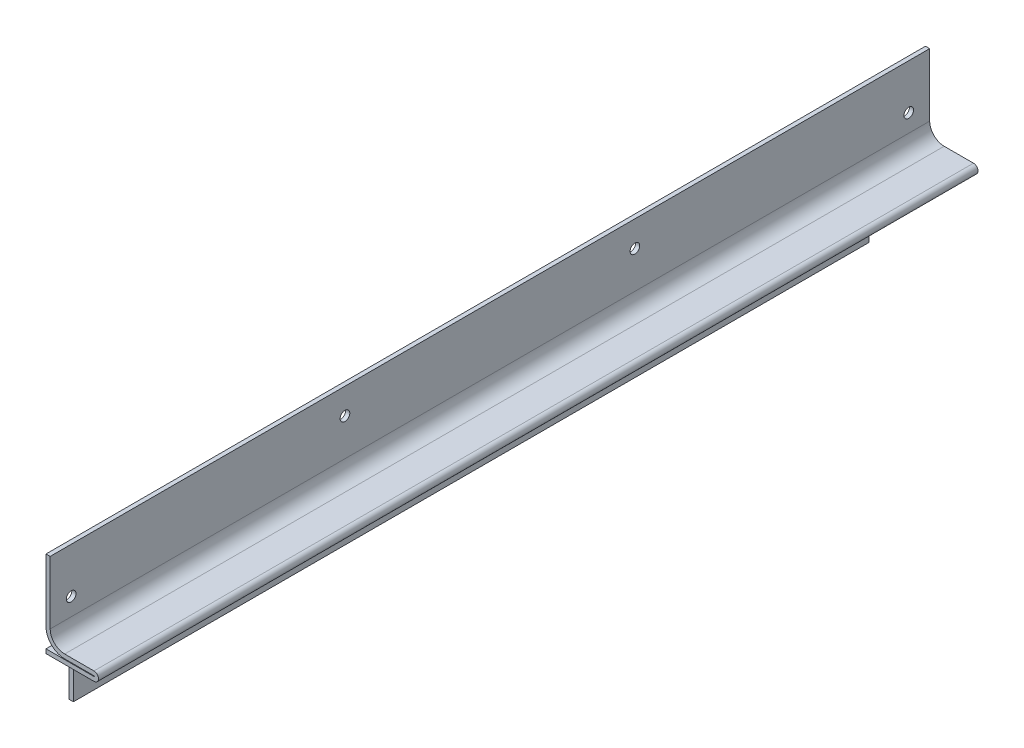
ISO-10303-21;
HEADER;
FILE_DESCRIPTION(('STEP AP214'),'2;1');
FILE_NAME('part.step','',(''),(''),'','','');
FILE_SCHEMA(('AUTOMOTIVE_DESIGN { 1 0 10303 214 1 1 1 1 }'));
ENDSEC;
DATA;
#1=APPLICATION_CONTEXT('core data for automotive mechanical design processes');
#2=APPLICATION_PROTOCOL_DEFINITION('international standard','automotive_design',2000,#1);
#3=PRODUCT_CONTEXT('',#1,'mechanical');
#4=PRODUCT('Part','Part','',(#3));
#5=PRODUCT_RELATED_PRODUCT_CATEGORY('part','',(#4));
#6=PRODUCT_DEFINITION_FORMATION('','',#4);
#7=PRODUCT_DEFINITION_CONTEXT('part definition',#1,'design');
#8=PRODUCT_DEFINITION('design','',#6,#7);
#9=PRODUCT_DEFINITION_SHAPE('','',#8);
#10=(LENGTH_UNIT() NAMED_UNIT(*) SI_UNIT(.MILLI.,.METRE.));
#11=(NAMED_UNIT(*) PLANE_ANGLE_UNIT() SI_UNIT($,.RADIAN.));
#12=(NAMED_UNIT(*) SI_UNIT($,.STERADIAN.) SOLID_ANGLE_UNIT());
#13=UNCERTAINTY_MEASURE_WITH_UNIT(LENGTH_MEASURE(1.E-05),#10,'distance_accuracy_value','');
#14=(GEOMETRIC_REPRESENTATION_CONTEXT(3) GLOBAL_UNCERTAINTY_ASSIGNED_CONTEXT((#13)) GLOBAL_UNIT_ASSIGNED_CONTEXT((#10,
#11,#12)) REPRESENTATION_CONTEXT('',''));
#15=CARTESIAN_POINT('',(0.,0.,0.));
#16=DIRECTION('',(0.,0.,1.));
#17=DIRECTION('',(1.,0.,0.));
#18=AXIS2_PLACEMENT_3D('',#15,#16,#17);
#19=CARTESIAN_POINT('',(-25.9398169786098,-36.9078676555998,-136.5));
#20=DIRECTION('',(0.,-1.,0.));
#21=DIRECTION('',(0.,0.,-1.));
#22=AXIS2_PLACEMENT_3D('',#19,#20,#21);
#23=PLANE('',#22);
#24=DIRECTION('',(1.,0.,0.));
#25=VECTOR('',#24,1.);
#26=CARTESIAN_POINT('',(-25.9398169786098,-36.9078676555998,123.5));
#27=LINE('',#26,#25);
#28=CARTESIAN_POINT('',(-25.9398169786098,-36.9078676555997,123.5));
#29=VERTEX_POINT('',#28);
#30=CARTESIAN_POINT('',(-27.2398169786098,-36.9078676555998,123.5));
#31=VERTEX_POINT('',#30);
#32=EDGE_CURVE('E159',#29,#31,#27,.F.);
#33=ORIENTED_EDGE('',*,*,#32,.T.);
#34=DIRECTION('',(0.,0.,1.));
#35=VECTOR('',#34,1.);
#36=CARTESIAN_POINT('',(-27.2398169786098,-36.9078676555998,-136.5));
#37=LINE('',#36,#35);
#38=CARTESIAN_POINT('',(-27.2398169786098,-36.9078676555998,-123.5));
#39=VERTEX_POINT('',#38);
#40=EDGE_CURVE('E191',#39,#31,#37,.T.);
#41=ORIENTED_EDGE('',*,*,#40,.F.);
#42=DIRECTION('',(1.,0.,0.));
#43=VECTOR('',#42,1.);
#44=CARTESIAN_POINT('',(-27.2398169786098,-36.9078676555998,-123.5));
#45=LINE('',#44,#43);
#46=CARTESIAN_POINT('',(-25.9398169786098,-36.9078676555998,-123.5));
#47=VERTEX_POINT('',#46);
#48=EDGE_CURVE('E195',#39,#47,#45,.T.);
#49=ORIENTED_EDGE('',*,*,#48,.T.);
#50=DIRECTION('',(0.,0.,-1.));
#51=VECTOR('',#50,1.);
#52=CARTESIAN_POINT('',(-25.9398169786098,-36.9078676555997,-136.5));
#53=LINE('',#52,#51);
#54=EDGE_CURVE('E209',#29,#47,#53,.T.);
#55=ORIENTED_EDGE('',*,*,#54,.F.);
#56=EDGE_LOOP('',(#33,#41,#49,#55));
#57=FACE_BOUND('',#56,.T.);
#58=ADVANCED_FACE('F17',(#57),#23,.T.);
#59=CARTESIAN_POINT('',(-27.2398169786098,-27.9078676555998,-110.5));
#60=DIRECTION('',(1.,0.,0.));
#61=DIRECTION('',(0.,0.,-1.));
#62=AXIS2_PLACEMENT_3D('',#59,#60,#61);
#63=CYLINDRICAL_SURFACE('',#62,2.09999999999999);
#64=CARTESIAN_POINT('',(-25.9398169786098,-27.9078676555998,-110.5));
#65=DIRECTION('',(1.,0.,0.));
#66=DIRECTION('',(0.,0.,-1.));
#67=AXIS2_PLACEMENT_3D('',#64,#65,#66);
#68=CIRCLE('',#67,2.09999999999999);
#69=CARTESIAN_POINT('',(-25.9398169786098,-27.9078676555998,-112.6));
#70=VERTEX_POINT('',#69);
#71=EDGE_CURVE('E192',#70,#70,#68,.F.);
#72=ORIENTED_EDGE('',*,*,#71,.F.);
#73=EDGE_LOOP('',(#72));
#74=FACE_BOUND('',#73,.T.);
#75=CARTESIAN_POINT('',(-27.2398169786098,-27.9078676555998,-110.5));
#76=DIRECTION('',(1.,0.,0.));
#77=DIRECTION('',(0.,0.,-1.));
#78=AXIS2_PLACEMENT_3D('',#75,#76,#77);
#79=CIRCLE('',#78,2.09999999999999);
#80=CARTESIAN_POINT('',(-27.2398169786098,-27.9078676555998,-112.6));
#81=VERTEX_POINT('',#80);
#82=EDGE_CURVE('E188',#81,#81,#79,.T.);
#83=ORIENTED_EDGE('',*,*,#82,.F.);
#84=EDGE_LOOP('',(#83));
#85=FACE_BOUND('',#84,.T.);
#86=ADVANCED_FACE('F520',(#74,#85),#63,.F.);
#87=CARTESIAN_POINT('',(-27.2398169786098,-27.9078676555998,-58.5));
#88=DIRECTION('',(1.,0.,0.));
#89=DIRECTION('',(0.,0.,-1.));
#90=AXIS2_PLACEMENT_3D('',#87,#88,#89);
#91=CYLINDRICAL_SURFACE('',#90,2.1);
#92=CARTESIAN_POINT('',(-25.9398169786098,-27.9078676555998,-58.5));
#93=DIRECTION('',(1.,0.,0.));
#94=DIRECTION('',(0.,0.,-1.));
#95=AXIS2_PLACEMENT_3D('',#92,#93,#94);
#96=CIRCLE('',#95,2.1);
#97=CARTESIAN_POINT('',(-25.9398169786098,-27.9078676555998,-60.6));
#98=VERTEX_POINT('',#97);
#99=EDGE_CURVE('E196',#98,#98,#96,.F.);
#100=ORIENTED_EDGE('',*,*,#99,.F.);
#101=EDGE_LOOP('',(#100));
#102=FACE_BOUND('',#101,.T.);
#103=CARTESIAN_POINT('',(-27.2398169786098,-27.9078676555998,-58.5));
#104=DIRECTION('',(1.,0.,0.));
#105=DIRECTION('',(0.,0.,-1.));
#106=AXIS2_PLACEMENT_3D('',#103,#104,#105);
#107=CIRCLE('',#106,2.1);
#108=CARTESIAN_POINT('',(-27.2398169786098,-27.9078676555998,-60.6));
#109=VERTEX_POINT('',#108);
#110=EDGE_CURVE('E185',#109,#109,#107,.T.);
#111=ORIENTED_EDGE('',*,*,#110,.F.);
#112=EDGE_LOOP('',(#111));
#113=FACE_BOUND('',#112,.T.);
#114=ADVANCED_FACE('F525',(#102,#113),#91,.F.);
#115=CARTESIAN_POINT('',(-27.2398169786098,-27.9078676555998,-84.5));
#116=DIRECTION('',(1.,0.,0.));
#117=DIRECTION('',(0.,1.,0.));
#118=AXIS2_PLACEMENT_3D('',#115,#116,#117);
#119=CYLINDRICAL_SURFACE('',#118,3.00000000000001);
#120=CARTESIAN_POINT('',(-25.9398169786098,-27.9078676555998,-84.5));
#121=DIRECTION('',(1.,0.,0.));
#122=DIRECTION('',(0.,1.,0.));
#123=AXIS2_PLACEMENT_3D('',#120,#121,#122);
#124=CIRCLE('',#123,3.00000000000001);
#125=CARTESIAN_POINT('',(-25.9398169786098,-24.9078676555998,-84.5));
#126=VERTEX_POINT('',#125);
#127=EDGE_CURVE('E199',#126,#126,#124,.F.);
#128=ORIENTED_EDGE('',*,*,#127,.F.);
#129=EDGE_LOOP('',(#128));
#130=FACE_BOUND('',#129,.T.);
#131=CARTESIAN_POINT('',(-27.2398169786098,-27.9078676555998,-84.5));
#132=DIRECTION('',(1.,0.,0.));
#133=DIRECTION('',(0.,1.,0.));
#134=AXIS2_PLACEMENT_3D('',#131,#132,#133);
#135=CIRCLE('',#134,3.00000000000001);
#136=CARTESIAN_POINT('',(-27.2398169786098,-24.9078676555998,-84.5));
#137=VERTEX_POINT('',#136);
#138=EDGE_CURVE('E182',#137,#137,#135,.T.);
#139=ORIENTED_EDGE('',*,*,#138,.F.);
#140=EDGE_LOOP('',(#139));
#141=FACE_BOUND('',#140,.T.);
#142=ADVANCED_FACE('F534',(#130,#141),#119,.F.);
#143=CARTESIAN_POINT('',(-26.5898169786098,-27.9078676555998,110.5));
#144=DIRECTION('',(1.,0.,0.));
#145=DIRECTION('',(0.,0.,-1.));
#146=AXIS2_PLACEMENT_3D('',#143,#144,#145);
#147=CYLINDRICAL_SURFACE('',#146,2.1);
#148=CARTESIAN_POINT('',(-25.9398169786098,-27.9078676555998,110.5));
#149=DIRECTION('',(1.,0.,0.));
#150=DIRECTION('',(0.,0.,-1.));
#151=AXIS2_PLACEMENT_3D('',#148,#149,#150);
#152=CIRCLE('',#151,2.1);
#153=CARTESIAN_POINT('',(-25.9398169786098,-27.9078676555998,108.4));
#154=VERTEX_POINT('',#153);
#155=EDGE_CURVE('E202',#154,#154,#152,.F.);
#156=ORIENTED_EDGE('',*,*,#155,.F.);
#157=EDGE_LOOP('',(#156));
#158=FACE_BOUND('',#157,.T.);
#159=CARTESIAN_POINT('',(-27.2398169786098,-27.9078676555998,110.5));
#160=DIRECTION('',(1.,0.,0.));
#161=DIRECTION('',(0.,0.,-1.));
#162=AXIS2_PLACEMENT_3D('',#159,#160,#161);
#163=CIRCLE('',#162,2.1);
#164=CARTESIAN_POINT('',(-27.2398169786098,-27.9078676555998,108.4));
#165=VERTEX_POINT('',#164);
#166=EDGE_CURVE('E179',#165,#165,#163,.T.);
#167=ORIENTED_EDGE('',*,*,#166,.F.);
#168=EDGE_LOOP('',(#167));
#169=FACE_BOUND('',#168,.T.);
#170=ADVANCED_FACE('F529',(#158,#169),#147,.F.);
#171=CARTESIAN_POINT('',(-26.5898169786098,-27.9078676555998,58.5));
#172=DIRECTION('',(1.,0.,0.));
#173=DIRECTION('',(0.,0.,-1.));
#174=AXIS2_PLACEMENT_3D('',#171,#172,#173);
#175=CYLINDRICAL_SURFACE('',#174,2.1);
#176=CARTESIAN_POINT('',(-25.9398169786098,-27.9078676555998,58.5));
#177=DIRECTION('',(1.,0.,0.));
#178=DIRECTION('',(0.,0.,-1.));
#179=AXIS2_PLACEMENT_3D('',#176,#177,#178);
#180=CIRCLE('',#179,2.1);
#181=CARTESIAN_POINT('',(-25.9398169786098,-27.9078676555998,56.4));
#182=VERTEX_POINT('',#181);
#183=EDGE_CURVE('E204',#182,#182,#180,.F.);
#184=ORIENTED_EDGE('',*,*,#183,.F.);
#185=EDGE_LOOP('',(#184));
#186=FACE_BOUND('',#185,.T.);
#187=CARTESIAN_POINT('',(-27.2398169786098,-27.9078676555998,58.5));
#188=DIRECTION('',(1.,0.,0.));
#189=DIRECTION('',(0.,0.,-1.));
#190=AXIS2_PLACEMENT_3D('',#187,#188,#189);
#191=CIRCLE('',#190,2.1);
#192=CARTESIAN_POINT('',(-27.2398169786098,-27.9078676555998,56.4));
#193=VERTEX_POINT('',#192);
#194=EDGE_CURVE('E176',#193,#193,#191,.T.);
#195=ORIENTED_EDGE('',*,*,#194,.F.);
#196=EDGE_LOOP('',(#195));
#197=FACE_BOUND('',#196,.T.);
#198=ADVANCED_FACE('F678',(#186,#197),#175,.F.);
#199=CARTESIAN_POINT('',(-26.5898169786098,-27.9078676555998,84.5));
#200=DIRECTION('',(1.,0.,0.));
#201=DIRECTION('',(0.,0.,-1.));
#202=AXIS2_PLACEMENT_3D('',#199,#200,#201);
#203=CYLINDRICAL_SURFACE('',#202,3.);
#204=CARTESIAN_POINT('',(-25.9398169786098,-27.9078676555998,84.5));
#205=DIRECTION('',(1.,0.,0.));
#206=DIRECTION('',(0.,0.,-1.));
#207=AXIS2_PLACEMENT_3D('',#204,#205,#206);
#208=CIRCLE('',#207,3.);
#209=CARTESIAN_POINT('',(-25.9398169786098,-27.9078676555998,81.5));
#210=VERTEX_POINT('',#209);
#211=EDGE_CURVE('E21',#210,#210,#208,.F.);
#212=ORIENTED_EDGE('',*,*,#211,.F.);
#213=EDGE_LOOP('',(#212));
#214=FACE_BOUND('',#213,.T.);
#215=CARTESIAN_POINT('',(-27.2398169786098,-27.9078676555998,84.5));
#216=DIRECTION('',(1.,0.,0.));
#217=DIRECTION('',(0.,0.,-1.));
#218=AXIS2_PLACEMENT_3D('',#215,#216,#217);
#219=CIRCLE('',#218,3.);
#220=CARTESIAN_POINT('',(-27.2398169786098,-27.9078676555998,81.5));
#221=VERTEX_POINT('',#220);
#222=EDGE_CURVE('E173',#221,#221,#219,.T.);
#223=ORIENTED_EDGE('',*,*,#222,.F.);
#224=EDGE_LOOP('',(#223));
#225=FACE_BOUND('',#224,.T.);
#226=ADVANCED_FACE('F670',(#214,#225),#203,.F.);
#227=CARTESIAN_POINT('',(-25.9398169786098,18.8711323444002,-136.5));
#228=DIRECTION('',(1.,0.,0.));
#229=DIRECTION('',(0.,0.,-1.));
#230=AXIS2_PLACEMENT_3D('',#227,#228,#229);
#231=PLANE('',#230);
#232=ORIENTED_EDGE('',*,*,#71,.T.);
#233=EDGE_LOOP('',(#232));
#234=FACE_BOUND('',#233,.T.);
#235=ORIENTED_EDGE('',*,*,#99,.T.);
#236=EDGE_LOOP('',(#235));
#237=FACE_BOUND('',#236,.T.);
#238=ORIENTED_EDGE('',*,*,#127,.T.);
#239=EDGE_LOOP('',(#238));
#240=FACE_BOUND('',#239,.T.);
#241=ORIENTED_EDGE('',*,*,#155,.T.);
#242=EDGE_LOOP('',(#241));
#243=FACE_BOUND('',#242,.T.);
#244=ORIENTED_EDGE('',*,*,#183,.T.);
#245=EDGE_LOOP('',(#244));
#246=FACE_BOUND('',#245,.T.);
#247=ORIENTED_EDGE('',*,*,#211,.T.);
#248=EDGE_LOOP('',(#247));
#249=FACE_BOUND('',#248,.T.);
#250=DIRECTION('',(0.,1.,0.));
#251=VECTOR('',#250,1.);
#252=CARTESIAN_POINT('',(-25.9398169786098,-12.0500206419999,123.5));
#253=LINE('',#252,#251);
#254=CARTESIAN_POINT('',(-25.9398169786098,-19.7074071403516,123.5));
#255=VERTEX_POINT('',#254);
#256=EDGE_CURVE('E144',#255,#29,#253,.F.);
#257=ORIENTED_EDGE('',*,*,#256,.T.);
#258=ORIENTED_EDGE('',*,*,#54,.T.);
#259=DIRECTION('',(0.,1.,0.));
#260=VECTOR('',#259,1.);
#261=CARTESIAN_POINT('',(-25.9398169786098,-36.9078676555998,-123.5));
#262=LINE('',#261,#260);
#263=CARTESIAN_POINT('',(-25.9398169786098,-19.7074071403516,-123.5));
#264=VERTEX_POINT('',#263);
#265=EDGE_CURVE('E146',#47,#264,#262,.T.);
#266=ORIENTED_EDGE('',*,*,#265,.T.);
#267=DIRECTION('',(0.,0.,1.));
#268=VECTOR('',#267,1.);
#269=CARTESIAN_POINT('',(-25.9398169786098,-19.7074071403516,0.));
#270=LINE('',#269,#268);
#271=EDGE_CURVE('E140',#264,#255,#270,.T.);
#272=ORIENTED_EDGE('',*,*,#271,.T.);
#273=EDGE_LOOP('',(#257,#258,#266,#272));
#274=FACE_BOUND('',#273,.T.);
#275=ADVANCED_FACE('F142',(#234,#237,#240,#243,#246,#249,#274),#231,.T.);
#276=CARTESIAN_POINT('',(-27.2398169786098,-36.9078676555998,-123.5));
#277=DIRECTION('',(0.,0.,1.));
#278=DIRECTION('',(1.,0.,0.));
#279=AXIS2_PLACEMENT_3D('',#276,#277,#278);
#280=PLANE('',#279);
#281=DIRECTION('',(0.,1.,0.));
#282=VECTOR('',#281,1.);
#283=CARTESIAN_POINT('',(-21.4398169786098,-22.4200881272211,-123.5));
#284=LINE('',#283,#282);
#285=CARTESIAN_POINT('',(-21.4398169786098,-13.9074071403516,-123.5));
#286=VERTEX_POINT('',#285);
#287=CARTESIAN_POINT('',(-21.4398169786098,-15.2074071403516,-123.5));
#288=VERTEX_POINT('',#287);
#289=EDGE_CURVE('E169',#286,#288,#284,.F.);
#290=ORIENTED_EDGE('',*,*,#289,.T.);
#291=CARTESIAN_POINT('',(-21.4398169786098,-19.7074071403516,-123.5));
#292=DIRECTION('',(0.,0.,1.));
#293=DIRECTION('',(1.,0.,0.));
#294=AXIS2_PLACEMENT_3D('',#291,#292,#293);
#295=CIRCLE('',#294,4.5);
#296=EDGE_CURVE('E167',#288,#264,#295,.T.);
#297=ORIENTED_EDGE('',*,*,#296,.T.);
#298=ORIENTED_EDGE('',*,*,#265,.F.);
#299=ORIENTED_EDGE('',*,*,#48,.F.);
#300=DIRECTION('',(0.,1.,0.));
#301=VECTOR('',#300,1.);
#302=CARTESIAN_POINT('',(-27.2398169786098,-36.9078676555998,-123.5));
#303=LINE('',#302,#301);
#304=CARTESIAN_POINT('',(-27.2398169786098,-19.7074071403516,-123.5));
#305=VERTEX_POINT('',#304);
#306=EDGE_CURVE('E308',#305,#39,#303,.F.);
#307=ORIENTED_EDGE('',*,*,#306,.F.);
#308=CARTESIAN_POINT('',(-21.4398169786098,-19.7074071403516,-123.5));
#309=DIRECTION('',(0.,0.,1.));
#310=DIRECTION('',(1.,0.,0.));
#311=AXIS2_PLACEMENT_3D('',#308,#309,#310);
#312=CIRCLE('',#311,5.8);
#313=EDGE_CURVE('E280',#286,#305,#312,.T.);
#314=ORIENTED_EDGE('',*,*,#313,.F.);
#315=EDGE_LOOP('',(#290,#297,#298,#299,#307,#314));
#316=FACE_BOUND('',#315,.T.);
#317=ADVANCED_FACE('F518',(#316),#280,.F.);
#318=CARTESIAN_POINT('',(-27.2398169786098,-36.9078676555998,-136.5));
#319=DIRECTION('',(-1.,0.,0.));
#320=DIRECTION('',(0.,0.,1.));
#321=AXIS2_PLACEMENT_3D('',#318,#319,#320);
#322=PLANE('',#321);
#323=ORIENTED_EDGE('',*,*,#222,.T.);
#324=EDGE_LOOP('',(#323));
#325=FACE_BOUND('',#324,.T.);
#326=ORIENTED_EDGE('',*,*,#194,.T.);
#327=EDGE_LOOP('',(#326));
#328=FACE_BOUND('',#327,.T.);
#329=ORIENTED_EDGE('',*,*,#166,.T.);
#330=EDGE_LOOP('',(#329));
#331=FACE_BOUND('',#330,.T.);
#332=ORIENTED_EDGE('',*,*,#138,.T.);
#333=EDGE_LOOP('',(#332));
#334=FACE_BOUND('',#333,.T.);
#335=ORIENTED_EDGE('',*,*,#110,.T.);
#336=EDGE_LOOP('',(#335));
#337=FACE_BOUND('',#336,.T.);
#338=ORIENTED_EDGE('',*,*,#82,.T.);
#339=EDGE_LOOP('',(#338));
#340=FACE_BOUND('',#339,.T.);
#341=DIRECTION('',(0.,1.,0.));
#342=VECTOR('',#341,1.);
#343=CARTESIAN_POINT('',(-27.2398169786098,-12.0500206419999,123.5));
#344=LINE('',#343,#342);
#345=CARTESIAN_POINT('',(-27.2398169786098,-19.7074071403516,123.5));
#346=VERTEX_POINT('',#345);
#347=EDGE_CURVE('E152',#31,#346,#344,.T.);
#348=ORIENTED_EDGE('',*,*,#347,.T.);
#349=DIRECTION('',(0.,0.,1.));
#350=VECTOR('',#349,1.);
#351=CARTESIAN_POINT('',(-27.2398169786098,-19.7074071403516,0.));
#352=LINE('',#351,#350);
#353=EDGE_CURVE('E279',#305,#346,#352,.T.);
#354=ORIENTED_EDGE('',*,*,#353,.F.);
#355=ORIENTED_EDGE('',*,*,#306,.T.);
#356=ORIENTED_EDGE('',*,*,#40,.T.);
#357=EDGE_LOOP('',(#348,#354,#355,#356));
#358=FACE_BOUND('',#357,.T.);
#359=ADVANCED_FACE('F318',(#325,#328,#331,#334,#337,#340,#358),#322,.T.);
#360=CARTESIAN_POINT('',(-27.2398169786098,-12.0500206419999,123.5));
#361=DIRECTION('',(0.,0.,-1.));
#362=DIRECTION('',(-1.,0.,0.));
#363=AXIS2_PLACEMENT_3D('',#360,#361,#362);
#364=PLANE('',#363);
#365=ORIENTED_EDGE('',*,*,#347,.F.);
#366=ORIENTED_EDGE('',*,*,#32,.F.);
#367=ORIENTED_EDGE('',*,*,#256,.F.);
#368=CARTESIAN_POINT('',(-21.4398169786098,-19.7074071403516,123.5));
#369=DIRECTION('',(0.,0.,1.));
#370=DIRECTION('',(1.,0.,0.));
#371=AXIS2_PLACEMENT_3D('',#368,#369,#370);
#372=CIRCLE('',#371,4.5);
#373=CARTESIAN_POINT('',(-21.4398169786098,-15.2074071403516,123.5));
#374=VERTEX_POINT('',#373);
#375=EDGE_CURVE('E151',#255,#374,#372,.F.);
#376=ORIENTED_EDGE('',*,*,#375,.T.);
#377=DIRECTION('',(0.,1.,0.));
#378=VECTOR('',#377,1.);
#379=CARTESIAN_POINT('',(-21.4398169786098,-12.0500206419999,123.5));
#380=LINE('',#379,#378);
#381=CARTESIAN_POINT('',(-21.4398169786098,-13.9074071403516,123.5));
#382=VERTEX_POINT('',#381);
#383=EDGE_CURVE('E161',#382,#374,#380,.F.);
#384=ORIENTED_EDGE('',*,*,#383,.F.);
#385=CARTESIAN_POINT('',(-21.4398169786098,-19.7074071403516,123.5));
#386=DIRECTION('',(0.,0.,1.));
#387=DIRECTION('',(1.,0.,0.));
#388=AXIS2_PLACEMENT_3D('',#385,#386,#387);
#389=CIRCLE('',#388,5.8);
#390=EDGE_CURVE('E277',#346,#382,#389,.F.);
#391=ORIENTED_EDGE('',*,*,#390,.F.);
#392=EDGE_LOOP('',(#365,#366,#367,#376,#384,#391));
#393=FACE_BOUND('',#392,.T.);
#394=ADVANCED_FACE('F157',(#393),#364,.F.);
#395=CARTESIAN_POINT('',(-21.4398169786098,-19.7074071403516,0.));
#396=DIRECTION('',(0.,0.,1.));
#397=DIRECTION('',(1.,0.,0.));
#398=AXIS2_PLACEMENT_3D('',#395,#396,#397);
#399=CYLINDRICAL_SURFACE('',#398,4.5);
#400=DIRECTION('',(0.,0.,-1.));
#401=VECTOR('',#400,1.);
#402=CARTESIAN_POINT('',(-21.4398169786098,-15.2074071403516,-136.5));
#403=LINE('',#402,#401);
#404=EDGE_CURVE('E165',#374,#288,#403,.T.);
#405=ORIENTED_EDGE('',*,*,#404,.F.);
#406=ORIENTED_EDGE('',*,*,#375,.F.);
#407=ORIENTED_EDGE('',*,*,#271,.F.);
#408=ORIENTED_EDGE('',*,*,#296,.F.);
#409=EDGE_LOOP('',(#405,#406,#407,#408));
#410=FACE_BOUND('',#409,.T.);
#411=ADVANCED_FACE('F163',(#410),#399,.F.);
#412=CARTESIAN_POINT('',(-21.4398169786098,-22.4200881272211,-130.));
#413=DIRECTION('',(1.,0.,0.));
#414=DIRECTION('',(0.,0.,-1.));
#415=AXIS2_PLACEMENT_3D('',#412,#413,#414);
#416=PLANE('',#415);
#417=DIRECTION('',(0.,1.,0.));
#418=VECTOR('',#417,1.);
#419=CARTESIAN_POINT('',(-21.4398169786098,-22.4200881272211,-136.5));
#420=LINE('',#419,#418);
#421=CARTESIAN_POINT('',(-21.4398169786098,-15.2074071403516,-136.5));
#422=VERTEX_POINT('',#421);
#423=CARTESIAN_POINT('',(-21.4398169786098,-13.9074071403516,-136.5));
#424=VERTEX_POINT('',#423);
#425=EDGE_CURVE('E282',#422,#424,#420,.T.);
#426=ORIENTED_EDGE('',*,*,#425,.F.);
#427=DIRECTION('',(0.,0.,-1.));
#428=VECTOR('',#427,1.);
#429=CARTESIAN_POINT('',(-21.4398169786098,-15.2074071403516,-136.5));
#430=LINE('',#429,#428);
#431=EDGE_CURVE('E300',#288,#422,#430,.T.);
#432=ORIENTED_EDGE('',*,*,#431,.F.);
#433=ORIENTED_EDGE('',*,*,#289,.F.);
#434=DIRECTION('',(0.,0.,1.));
#435=VECTOR('',#434,1.);
#436=CARTESIAN_POINT('',(-21.4398169786098,-13.9074071403516,-136.5));
#437=LINE('',#436,#435);
#438=EDGE_CURVE('E471',#424,#286,#437,.T.);
#439=ORIENTED_EDGE('',*,*,#438,.F.);
#440=EDGE_LOOP('',(#426,#432,#433,#439));
#441=FACE_BOUND('',#440,.T.);
#442=ADVANCED_FACE('F326',(#441),#416,.F.);
#443=CARTESIAN_POINT('',(-21.4398169786098,-19.7074071403516,0.));
#444=DIRECTION('',(0.,0.,1.));
#445=DIRECTION('',(1.,0.,0.));
#446=AXIS2_PLACEMENT_3D('',#443,#444,#445);
#447=CYLINDRICAL_SURFACE('',#446,5.8);
#448=ORIENTED_EDGE('',*,*,#390,.T.);
#449=DIRECTION('',(0.,0.,1.));
#450=VECTOR('',#449,1.);
#451=CARTESIAN_POINT('',(-21.4398169786098,-13.9074071403516,-136.5));
#452=LINE('',#451,#450);
#453=EDGE_CURVE('E295',#286,#382,#452,.T.);
#454=ORIENTED_EDGE('',*,*,#453,.F.);
#455=ORIENTED_EDGE('',*,*,#313,.T.);
#456=ORIENTED_EDGE('',*,*,#353,.T.);
#457=EDGE_LOOP('',(#448,#454,#455,#456));
#458=FACE_BOUND('',#457,.T.);
#459=ADVANCED_FACE('F323',(#458),#447,.T.);
#460=CARTESIAN_POINT('',(-21.4398169786098,-24.4789441487998,130.));
#461=DIRECTION('',(1.,0.,0.));
#462=DIRECTION('',(0.,0.,-1.));
#463=AXIS2_PLACEMENT_3D('',#460,#461,#462);
#464=PLANE('',#463);
#465=ORIENTED_EDGE('',*,*,#383,.T.);
#466=DIRECTION('',(0.,0.,-1.));
#467=VECTOR('',#466,1.);
#468=CARTESIAN_POINT('',(-21.4398169786098,-15.2074071403516,-136.5));
#469=LINE('',#468,#467);
#470=CARTESIAN_POINT('',(-21.4398169786098,-15.2074071403516,136.5));
#471=VERTEX_POINT('',#470);
#472=EDGE_CURVE('E273',#471,#374,#469,.T.);
#473=ORIENTED_EDGE('',*,*,#472,.F.);
#474=DIRECTION('',(0.,1.,0.));
#475=VECTOR('',#474,1.);
#476=CARTESIAN_POINT('',(-21.4398169786098,-24.4789441487998,136.5));
#477=LINE('',#476,#475);
#478=CARTESIAN_POINT('',(-21.4398169786098,-13.9074071403516,136.5));
#479=VERTEX_POINT('',#478);
#480=EDGE_CURVE('E276',#479,#471,#477,.F.);
#481=ORIENTED_EDGE('',*,*,#480,.F.);
#482=DIRECTION('',(0.,0.,1.));
#483=VECTOR('',#482,1.);
#484=CARTESIAN_POINT('',(-21.4398169786098,-13.9074071403516,-136.5));
#485=LINE('',#484,#483);
#486=EDGE_CURVE('E404',#382,#479,#485,.T.);
#487=ORIENTED_EDGE('',*,*,#486,.F.);
#488=EDGE_LOOP('',(#465,#473,#481,#487));
#489=FACE_BOUND('',#488,.T.);
#490=ADVANCED_FACE('F325',(#489),#464,.F.);
#491=CARTESIAN_POINT('',(-6.53950672657401,-13.8074071403516,0.));
#492=DIRECTION('',(0.,0.,-1.));
#493=DIRECTION('',(-1.,0.,0.));
#494=AXIS2_PLACEMENT_3D('',#491,#492,#493);
#495=CYLINDRICAL_SURFACE('',#494,0.099999999999998);
#496=DIRECTION('',(0.,0.,1.));
#497=VECTOR('',#496,1.);
#498=CARTESIAN_POINT('',(-6.53950672657398,-13.9074071403516,-136.5));
#499=LINE('',#498,#497);
#500=CARTESIAN_POINT('',(-6.53950672657398,-13.9074071403516,136.5));
#501=VERTEX_POINT('',#500);
#502=CARTESIAN_POINT('',(-6.53950672657401,-13.9074071403516,-136.5));
#503=VERTEX_POINT('',#502);
#504=EDGE_CURVE('E398',#501,#503,#499,.F.);
#505=ORIENTED_EDGE('',*,*,#504,.F.);
#506=CARTESIAN_POINT('',(-6.53950672657398,-13.8074071403516,136.5));
#507=DIRECTION('',(0.,0.,-1.));
#508=DIRECTION('',(-1.,0.,0.));
#509=AXIS2_PLACEMENT_3D('',#506,#507,#508);
#510=CIRCLE('',#509,0.099999999999998);
#511=CARTESIAN_POINT('',(-6.53950672657401,-13.7074071403516,136.5));
#512=VERTEX_POINT('',#511);
#513=EDGE_CURVE('E274',#512,#501,#510,.T.);
#514=ORIENTED_EDGE('',*,*,#513,.F.);
#515=DIRECTION('',(0.,0.,-1.));
#516=VECTOR('',#515,1.);
#517=CARTESIAN_POINT('',(-6.53950672657404,-13.7074071403516,-136.5));
#518=LINE('',#517,#516);
#519=CARTESIAN_POINT('',(-6.53950672657404,-13.7074071403516,-136.5));
#520=VERTEX_POINT('',#519);
#521=EDGE_CURVE('E472',#520,#512,#518,.F.);
#522=ORIENTED_EDGE('',*,*,#521,.F.);
#523=CARTESIAN_POINT('',(-6.53950672657404,-13.8074071403516,-136.5));
#524=DIRECTION('',(0.,0.,-1.));
#525=DIRECTION('',(-1.,0.,0.));
#526=AXIS2_PLACEMENT_3D('',#523,#524,#525);
#527=CIRCLE('',#526,0.099999999999998);
#528=EDGE_CURVE('E271',#503,#520,#527,.F.);
#529=ORIENTED_EDGE('',*,*,#528,.F.);
#530=EDGE_LOOP('',(#505,#514,#522,#529));
#531=FACE_BOUND('',#530,.T.);
#532=ADVANCED_FACE('F333',(#531),#495,.F.);
#533=CARTESIAN_POINT('',(9.17164353663828,-15.2074071403516,-136.5));
#534=DIRECTION('',(0.,-1.,0.));
#535=DIRECTION('',(0.,0.,-1.));
#536=AXIS2_PLACEMENT_3D('',#533,#534,#535);
#537=PLANE('',#536);
#538=DIRECTION('',(0.,0.,-1.));
#539=VECTOR('',#538,1.);
#540=CARTESIAN_POINT('',(-6.53950672657401,-15.2074071403516,0.));
#541=LINE('',#540,#539);
#542=CARTESIAN_POINT('',(-6.53950672657398,-15.2074071403516,136.5));
#543=VERTEX_POINT('',#542);
#544=CARTESIAN_POINT('',(-6.53950672657404,-15.2074071403516,-136.5));
#545=VERTEX_POINT('',#544);
#546=EDGE_CURVE('E482',#543,#545,#541,.T.);
#547=ORIENTED_EDGE('',*,*,#546,.F.);
#548=DIRECTION('',(1.,0.,0.));
#549=VECTOR('',#548,1.);
#550=CARTESIAN_POINT('',(-22.715043067783,-15.2074071403516,136.5));
#551=LINE('',#550,#549);
#552=EDGE_CURVE('E260',#471,#543,#551,.T.);
#553=ORIENTED_EDGE('',*,*,#552,.F.);
#554=ORIENTED_EDGE('',*,*,#472,.T.);
#555=ORIENTED_EDGE('',*,*,#404,.T.);
#556=ORIENTED_EDGE('',*,*,#431,.T.);
#557=DIRECTION('',(1.,0.,0.));
#558=VECTOR('',#557,1.);
#559=CARTESIAN_POINT('',(-22.715043067783,-15.2074071403516,-136.5));
#560=LINE('',#559,#558);
#561=EDGE_CURVE('E270',#422,#545,#560,.T.);
#562=ORIENTED_EDGE('',*,*,#561,.T.);
#563=EDGE_LOOP('',(#547,#553,#554,#555,#556,#562));
#564=FACE_BOUND('',#563,.T.);
#565=ADVANCED_FACE('F387',(#564),#537,.T.);
#566=CARTESIAN_POINT('',(-6.53950672657401,-13.8074071403516,0.));
#567=DIRECTION('',(0.,0.,-1.));
#568=DIRECTION('',(-1.,0.,0.));
#569=AXIS2_PLACEMENT_3D('',#566,#567,#568);
#570=CYLINDRICAL_SURFACE('',#569,1.4);
#571=CARTESIAN_POINT('',(-6.53950672657398,-13.8074071403516,136.5));
#572=DIRECTION('',(0.,0.,-1.));
#573=DIRECTION('',(-1.,0.,0.));
#574=AXIS2_PLACEMENT_3D('',#571,#572,#573);
#575=CIRCLE('',#574,1.4);
#576=CARTESIAN_POINT('',(-6.53950672657398,-12.4074071403516,136.5));
#577=VERTEX_POINT('',#576);
#578=EDGE_CURVE('E257',#543,#577,#575,.F.);
#579=ORIENTED_EDGE('',*,*,#578,.F.);
#580=ORIENTED_EDGE('',*,*,#546,.T.);
#581=CARTESIAN_POINT('',(-6.53950672657404,-13.8074071403516,-136.5));
#582=DIRECTION('',(0.,0.,-1.));
#583=DIRECTION('',(-1.,0.,0.));
#584=AXIS2_PLACEMENT_3D('',#581,#582,#583);
#585=CIRCLE('',#584,1.4);
#586=CARTESIAN_POINT('',(-6.53950672657401,-12.4074071403516,-136.5));
#587=VERTEX_POINT('',#586);
#588=EDGE_CURVE('E268',#545,#587,#585,.F.);
#589=ORIENTED_EDGE('',*,*,#588,.T.);
#590=DIRECTION('',(0.,0.,1.));
#591=VECTOR('',#590,1.);
#592=CARTESIAN_POINT('',(-6.53950672657398,-12.4074071403516,-136.5));
#593=LINE('',#592,#591);
#594=EDGE_CURVE('E474',#577,#587,#593,.F.);
#595=ORIENTED_EDGE('',*,*,#594,.F.);
#596=EDGE_LOOP('',(#579,#580,#589,#595));
#597=FACE_BOUND('',#596,.T.);
#598=ADVANCED_FACE('F383',(#597),#570,.T.);
#599=CARTESIAN_POINT('',(-20.139506726574,-12.4074071403516,-136.5));
#600=DIRECTION('',(0.,1.,0.));
#601=DIRECTION('',(0.,0.,1.));
#602=AXIS2_PLACEMENT_3D('',#599,#600,#601);
#603=PLANE('',#602);
#604=DIRECTION('',(0.,0.,-1.));
#605=VECTOR('',#604,1.);
#606=CARTESIAN_POINT('',(-15.639506726574,-12.4074071403516,0.));
#607=LINE('',#606,#605);
#608=CARTESIAN_POINT('',(-15.639506726574,-12.4074071403516,-136.5));
#609=VERTEX_POINT('',#608);
#610=CARTESIAN_POINT('',(-15.639506726574,-12.4074071403516,136.5));
#611=VERTEX_POINT('',#610);
#612=EDGE_CURVE('E462',#609,#611,#607,.F.);
#613=ORIENTED_EDGE('',*,*,#612,.T.);
#614=DIRECTION('',(1.,0.,0.));
#615=VECTOR('',#614,1.);
#616=CARTESIAN_POINT('',(-22.715043067783,-12.4074071403516,136.5));
#617=LINE('',#616,#615);
#618=EDGE_CURVE('E256',#577,#611,#617,.F.);
#619=ORIENTED_EDGE('',*,*,#618,.F.);
#620=ORIENTED_EDGE('',*,*,#594,.T.);
#621=DIRECTION('',(1.,0.,0.));
#622=VECTOR('',#621,1.);
#623=CARTESIAN_POINT('',(-22.715043067783,-12.4074071403516,-136.5));
#624=LINE('',#623,#622);
#625=EDGE_CURVE('E267',#587,#609,#624,.F.);
#626=ORIENTED_EDGE('',*,*,#625,.T.);
#627=EDGE_LOOP('',(#613,#619,#620,#626));
#628=FACE_BOUND('',#627,.T.);
#629=ADVANCED_FACE('F379',(#628),#603,.T.);
#630=CARTESIAN_POINT('',(-15.639506726574,-7.90740714035162,0.));
#631=DIRECTION('',(0.,0.,-1.));
#632=DIRECTION('',(-1.,0.,0.));
#633=AXIS2_PLACEMENT_3D('',#630,#631,#632);
#634=CYLINDRICAL_SURFACE('',#633,5.8);
#635=DIRECTION('',(0.,0.,-1.));
#636=VECTOR('',#635,1.);
#637=CARTESIAN_POINT('',(-15.639506726574,-13.7074071403516,-136.5));
#638=LINE('',#637,#636);
#639=CARTESIAN_POINT('',(-15.639506726574,-13.7074071403516,136.5));
#640=VERTEX_POINT('',#639);
#641=CARTESIAN_POINT('',(-15.639506726574,-13.7074071403516,-136.5));
#642=VERTEX_POINT('',#641);
#643=EDGE_CURVE('E468',#640,#642,#638,.T.);
#644=ORIENTED_EDGE('',*,*,#643,.F.);
#645=CARTESIAN_POINT('',(-15.639506726574,-7.90740714035162,136.5));
#646=DIRECTION('',(0.,0.,-1.));
#647=DIRECTION('',(-1.,0.,0.));
#648=AXIS2_PLACEMENT_3D('',#645,#646,#647);
#649=CIRCLE('',#648,5.8);
#650=CARTESIAN_POINT('',(-21.439506726574,-7.90740714035162,136.5));
#651=VERTEX_POINT('',#650);
#652=EDGE_CURVE('E248',#651,#640,#649,.F.);
#653=ORIENTED_EDGE('',*,*,#652,.F.);
#654=DIRECTION('',(0.,0.,1.));
#655=VECTOR('',#654,1.);
#656=CARTESIAN_POINT('',(-21.439506726574,-7.90740714035162,-136.5));
#657=LINE('',#656,#655);
#658=CARTESIAN_POINT('',(-21.439506726574,-7.90740714035162,-136.5));
#659=VERTEX_POINT('',#658);
#660=EDGE_CURVE('E403',#659,#651,#657,.T.);
#661=ORIENTED_EDGE('',*,*,#660,.F.);
#662=CARTESIAN_POINT('',(-15.639506726574,-7.90740714035162,-136.5));
#663=DIRECTION('',(0.,0.,-1.));
#664=DIRECTION('',(-1.,0.,0.));
#665=AXIS2_PLACEMENT_3D('',#662,#663,#664);
#666=CIRCLE('',#665,5.8);
#667=EDGE_CURVE('E261',#659,#642,#666,.F.);
#668=ORIENTED_EDGE('',*,*,#667,.T.);
#669=EDGE_LOOP('',(#644,#653,#661,#668));
#670=FACE_BOUND('',#669,.T.);
#671=ADVANCED_FACE('F375',(#670),#634,.T.);
#672=CARTESIAN_POINT('',(35.639493273426,-13.7074071403516,-136.5));
#673=DIRECTION('',(0.,-1.,0.));
#674=DIRECTION('',(0.,0.,-1.));
#675=AXIS2_PLACEMENT_3D('',#672,#673,#674);
#676=PLANE('',#675);
#677=ORIENTED_EDGE('',*,*,#643,.T.);
#678=DIRECTION('',(1.,0.,0.));
#679=VECTOR('',#678,1.);
#680=CARTESIAN_POINT('',(-22.715043067783,-13.7074071403516,-136.5));
#681=LINE('',#680,#679);
#682=EDGE_CURVE('E263',#642,#520,#681,.T.);
#683=ORIENTED_EDGE('',*,*,#682,.T.);
#684=ORIENTED_EDGE('',*,*,#521,.T.);
#685=DIRECTION('',(1.,0.,0.));
#686=VECTOR('',#685,1.);
#687=CARTESIAN_POINT('',(-22.715043067783,-13.7074071403516,136.5));
#688=LINE('',#687,#686);
#689=EDGE_CURVE('E251',#640,#512,#688,.T.);
#690=ORIENTED_EDGE('',*,*,#689,.F.);
#691=EDGE_LOOP('',(#677,#683,#684,#690));
#692=FACE_BOUND('',#691,.T.);
#693=ADVANCED_FACE('F371',(#692),#676,.T.);
#694=CARTESIAN_POINT('',(-46.6073564633617,-13.9074071403516,-136.5));
#695=DIRECTION('',(0.,1.,0.));
#696=DIRECTION('',(0.,0.,1.));
#697=AXIS2_PLACEMENT_3D('',#694,#695,#696);
#698=PLANE('',#697);
#699=ORIENTED_EDGE('',*,*,#504,.T.);
#700=DIRECTION('',(1.,0.,0.));
#701=VECTOR('',#700,1.);
#702=CARTESIAN_POINT('',(-22.715043067783,-13.9074071403516,-136.5));
#703=LINE('',#702,#701);
#704=EDGE_CURVE('E444',#503,#424,#703,.F.);
#705=ORIENTED_EDGE('',*,*,#704,.T.);
#706=ORIENTED_EDGE('',*,*,#438,.T.);
#707=ORIENTED_EDGE('',*,*,#453,.T.);
#708=ORIENTED_EDGE('',*,*,#486,.T.);
#709=DIRECTION('',(1.,0.,0.));
#710=VECTOR('',#709,1.);
#711=CARTESIAN_POINT('',(-22.715043067783,-13.9074071403516,136.5));
#712=LINE('',#711,#710);
#713=EDGE_CURVE('E247',#501,#479,#712,.F.);
#714=ORIENTED_EDGE('',*,*,#713,.F.);
#715=EDGE_LOOP('',(#699,#705,#706,#707,#708,#714));
#716=FACE_BOUND('',#715,.T.);
#717=ADVANCED_FACE('F367',(#716),#698,.T.);
#718=CARTESIAN_POINT('',(-21.439506726574,-13.7074071403516,-136.5));
#719=DIRECTION('',(-1.,0.,0.));
#720=DIRECTION('',(0.,0.,1.));
#721=AXIS2_PLACEMENT_3D('',#718,#719,#720);
#722=PLANE('',#721);
#723=CARTESIAN_POINT('',(-21.439506726574,3.59259285964838,45.));
#724=DIRECTION('',(1.,0.,0.));
#725=DIRECTION('',(0.,0.,-1.));
#726=AXIS2_PLACEMENT_3D('',#723,#724,#725);
#727=CIRCLE('',#726,1.5);
#728=CARTESIAN_POINT('',(-21.439506726574,3.59259285964838,43.5));
#729=VERTEX_POINT('',#728);
#730=EDGE_CURVE('E234',#729,#729,#727,.T.);
#731=ORIENTED_EDGE('',*,*,#730,.T.);
#732=EDGE_LOOP('',(#731));
#733=FACE_BOUND('',#732,.T.);
#734=CARTESIAN_POINT('',(-21.439506726574,3.59259285964839,-45.));
#735=DIRECTION('',(1.,0.,0.));
#736=DIRECTION('',(0.,0.,-1.));
#737=AXIS2_PLACEMENT_3D('',#734,#735,#736);
#738=CIRCLE('',#737,1.50000000000001);
#739=CARTESIAN_POINT('',(-21.439506726574,3.59259285964839,-46.5));
#740=VERTEX_POINT('',#739);
#741=EDGE_CURVE('E238',#740,#740,#738,.T.);
#742=ORIENTED_EDGE('',*,*,#741,.T.);
#743=EDGE_LOOP('',(#742));
#744=FACE_BOUND('',#743,.T.);
#745=CARTESIAN_POINT('',(-21.439506726574,-2.40740714035162,-130.));
#746=DIRECTION('',(1.,0.,0.));
#747=DIRECTION('',(0.,0.,-1.));
#748=AXIS2_PLACEMENT_3D('',#745,#746,#747);
#749=CIRCLE('',#748,1.50000000000001);
#750=CARTESIAN_POINT('',(-21.439506726574,-2.40740714035162,-131.5));
#751=VERTEX_POINT('',#750);
#752=EDGE_CURVE('E241',#751,#751,#749,.T.);
#753=ORIENTED_EDGE('',*,*,#752,.T.);
#754=EDGE_LOOP('',(#753));
#755=FACE_BOUND('',#754,.T.);
#756=CARTESIAN_POINT('',(-21.439506726574,-2.40740714035162,130.));
#757=DIRECTION('',(1.,0.,0.));
#758=DIRECTION('',(0.,0.,-1.));
#759=AXIS2_PLACEMENT_3D('',#756,#757,#758);
#760=CIRCLE('',#759,1.5);
#761=CARTESIAN_POINT('',(-21.439506726574,-2.40740714035162,128.5));
#762=VERTEX_POINT('',#761);
#763=EDGE_CURVE('E244',#762,#762,#760,.T.);
#764=ORIENTED_EDGE('',*,*,#763,.T.);
#765=EDGE_LOOP('',(#764));
#766=FACE_BOUND('',#765,.T.);
#767=DIRECTION('',(0.,0.,1.));
#768=VECTOR('',#767,1.);
#769=CARTESIAN_POINT('',(-21.439506726574,11.5925928596484,-136.5));
#770=LINE('',#769,#768);
#771=CARTESIAN_POINT('',(-21.439506726574,11.5925928596484,-136.5));
#772=VERTEX_POINT('',#771);
#773=CARTESIAN_POINT('',(-21.439506726574,11.5925928596484,136.5));
#774=VERTEX_POINT('',#773);
#775=EDGE_CURVE('E423',#772,#774,#770,.T.);
#776=ORIENTED_EDGE('',*,*,#775,.F.);
#777=DIRECTION('',(0.,1.,0.));
#778=VECTOR('',#777,1.);
#779=CARTESIAN_POINT('',(-21.439506726574,-0.243141566426576,-136.5));
#780=LINE('',#779,#778);
#781=EDGE_CURVE('E264',#772,#659,#780,.F.);
#782=ORIENTED_EDGE('',*,*,#781,.T.);
#783=ORIENTED_EDGE('',*,*,#660,.T.);
#784=DIRECTION('',(0.,1.,0.));
#785=VECTOR('',#784,1.);
#786=CARTESIAN_POINT('',(-21.439506726574,-0.243141566426536,136.5));
#787=LINE('',#786,#785);
#788=EDGE_CURVE('E252',#774,#651,#787,.F.);
#789=ORIENTED_EDGE('',*,*,#788,.F.);
#790=EDGE_LOOP('',(#776,#782,#783,#789));
#791=FACE_BOUND('',#790,.T.);
#792=ADVANCED_FACE('F363',(#733,#744,#755,#766,#791),#722,.T.);
#793=CARTESIAN_POINT('',(-15.639506726574,-7.90740714035162,0.));
#794=DIRECTION('',(0.,0.,-1.));
#795=DIRECTION('',(-1.,0.,0.));
#796=AXIS2_PLACEMENT_3D('',#793,#794,#795);
#797=CYLINDRICAL_SURFACE('',#796,4.5);
#798=CARTESIAN_POINT('',(-15.639506726574,-7.90740714035162,136.5));
#799=DIRECTION('',(0.,0.,-1.));
#800=DIRECTION('',(-1.,0.,0.));
#801=AXIS2_PLACEMENT_3D('',#798,#799,#800);
#802=CIRCLE('',#801,4.5);
#803=CARTESIAN_POINT('',(-20.139506726574,-7.90740714035162,136.5));
#804=VERTEX_POINT('',#803);
#805=EDGE_CURVE('E253',#611,#804,#802,.T.);
#806=ORIENTED_EDGE('',*,*,#805,.F.);
#807=ORIENTED_EDGE('',*,*,#612,.F.);
#808=CARTESIAN_POINT('',(-15.639506726574,-7.90740714035162,-136.5));
#809=DIRECTION('',(0.,0.,-1.));
#810=DIRECTION('',(-1.,0.,0.));
#811=AXIS2_PLACEMENT_3D('',#808,#809,#810);
#812=CIRCLE('',#811,4.5);
#813=CARTESIAN_POINT('',(-20.139506726574,-7.90740714035162,-136.5));
#814=VERTEX_POINT('',#813);
#815=EDGE_CURVE('E265',#609,#814,#812,.T.);
#816=ORIENTED_EDGE('',*,*,#815,.T.);
#817=DIRECTION('',(0.,0.,-1.));
#818=VECTOR('',#817,1.);
#819=CARTESIAN_POINT('',(-20.139506726574,-7.90740714035162,-136.5));
#820=LINE('',#819,#818);
#821=EDGE_CURVE('E237',#804,#814,#820,.T.);
#822=ORIENTED_EDGE('',*,*,#821,.F.);
#823=EDGE_LOOP('',(#806,#807,#816,#822));
#824=FACE_BOUND('',#823,.T.);
#825=ADVANCED_FACE('F360',(#824),#797,.F.);
#826=CARTESIAN_POINT('',(-22.715043067783,-0.243141566426576,-136.5));
#827=DIRECTION('',(0.,0.,1.));
#828=DIRECTION('',(1.,0.,0.));
#829=AXIS2_PLACEMENT_3D('',#826,#827,#828);
#830=PLANE('',#829);
#831=ORIENTED_EDGE('',*,*,#704,.F.);
#832=ORIENTED_EDGE('',*,*,#528,.T.);
#833=ORIENTED_EDGE('',*,*,#682,.F.);
#834=ORIENTED_EDGE('',*,*,#667,.F.);
#835=ORIENTED_EDGE('',*,*,#781,.F.);
#836=DIRECTION('',(1.,0.,0.));
#837=VECTOR('',#836,1.);
#838=CARTESIAN_POINT('',(-21.439506726574,11.5925928596484,-136.5));
#839=LINE('',#838,#837);
#840=CARTESIAN_POINT('',(-20.139506726574,11.5925928596484,-136.5));
#841=VERTEX_POINT('',#840);
#842=EDGE_CURVE('E441',#841,#772,#839,.F.);
#843=ORIENTED_EDGE('',*,*,#842,.F.);
#844=DIRECTION('',(0.,1.,0.));
#845=VECTOR('',#844,1.);
#846=CARTESIAN_POINT('',(-20.139506726574,11.5925928596484,-136.5));
#847=LINE('',#846,#845);
#848=EDGE_CURVE('E428',#814,#841,#847,.T.);
#849=ORIENTED_EDGE('',*,*,#848,.F.);
#850=ORIENTED_EDGE('',*,*,#815,.F.);
#851=ORIENTED_EDGE('',*,*,#625,.F.);
#852=ORIENTED_EDGE('',*,*,#588,.F.);
#853=ORIENTED_EDGE('',*,*,#561,.F.);
#854=ORIENTED_EDGE('',*,*,#425,.T.);
#855=EDGE_LOOP('',(#831,#832,#833,#834,#835,#843,#849,#850,#851,#852,#853,#854));
#856=FACE_BOUND('',#855,.T.);
#857=ADVANCED_FACE('F357',(#856),#830,.F.);
#858=CARTESIAN_POINT('',(-21.439506726574,11.5925928596484,-136.5));
#859=DIRECTION('',(0.,1.,0.));
#860=DIRECTION('',(0.,0.,1.));
#861=AXIS2_PLACEMENT_3D('',#858,#859,#860);
#862=PLANE('',#861);
#863=ORIENTED_EDGE('',*,*,#842,.T.);
#864=ORIENTED_EDGE('',*,*,#775,.T.);
#865=DIRECTION('',(1.,0.,0.));
#866=VECTOR('',#865,1.);
#867=CARTESIAN_POINT('',(-22.715043067783,11.5925928596484,136.5));
#868=LINE('',#867,#866);
#869=CARTESIAN_POINT('',(-20.139506726574,11.5925928596484,136.5));
#870=VERTEX_POINT('',#869);
#871=EDGE_CURVE('E36',#870,#774,#868,.F.);
#872=ORIENTED_EDGE('',*,*,#871,.F.);
#873=DIRECTION('',(0.,0.,-1.));
#874=VECTOR('',#873,1.);
#875=CARTESIAN_POINT('',(-20.139506726574,11.5925928596484,-136.5));
#876=LINE('',#875,#874);
#877=EDGE_CURVE('E431',#841,#870,#876,.F.);
#878=ORIENTED_EDGE('',*,*,#877,.F.);
#879=EDGE_LOOP('',(#863,#864,#872,#878));
#880=FACE_BOUND('',#879,.T.);
#881=ADVANCED_FACE('F353',(#880),#862,.T.);
#882=CARTESIAN_POINT('',(-22.715043067783,-0.243141566426536,136.5));
#883=DIRECTION('',(0.,0.,1.));
#884=DIRECTION('',(1.,0.,0.));
#885=AXIS2_PLACEMENT_3D('',#882,#883,#884);
#886=PLANE('',#885);
#887=ORIENTED_EDGE('',*,*,#513,.T.);
#888=ORIENTED_EDGE('',*,*,#713,.T.);
#889=ORIENTED_EDGE('',*,*,#480,.T.);
#890=ORIENTED_EDGE('',*,*,#552,.T.);
#891=ORIENTED_EDGE('',*,*,#578,.T.);
#892=ORIENTED_EDGE('',*,*,#618,.T.);
#893=ORIENTED_EDGE('',*,*,#805,.T.);
#894=DIRECTION('',(0.,1.,0.));
#895=VECTOR('',#894,1.);
#896=CARTESIAN_POINT('',(-20.139506726574,11.5925928596484,136.5));
#897=LINE('',#896,#895);
#898=EDGE_CURVE('E233',#870,#804,#897,.F.);
#899=ORIENTED_EDGE('',*,*,#898,.F.);
#900=ORIENTED_EDGE('',*,*,#871,.T.);
#901=ORIENTED_EDGE('',*,*,#788,.T.);
#902=ORIENTED_EDGE('',*,*,#652,.T.);
#903=ORIENTED_EDGE('',*,*,#689,.T.);
#904=EDGE_LOOP('',(#887,#888,#889,#890,#891,#892,#893,#899,#900,#901,#902,#903));
#905=FACE_BOUND('',#904,.T.);
#906=ADVANCED_FACE('F349',(#905),#886,.T.);
#907=CARTESIAN_POINT('',(-21.439506726574,-2.40740714035162,130.));
#908=DIRECTION('',(1.,0.,0.));
#909=DIRECTION('',(0.,0.,-1.));
#910=AXIS2_PLACEMENT_3D('',#907,#908,#909);
#911=CYLINDRICAL_SURFACE('',#910,1.5);
#912=CARTESIAN_POINT('',(-20.139506726574,-2.40740714035162,130.));
#913=DIRECTION('',(1.,0.,0.));
#914=DIRECTION('',(0.,0.,-1.));
#915=AXIS2_PLACEMENT_3D('',#912,#913,#914);
#916=CIRCLE('',#915,1.5);
#917=CARTESIAN_POINT('',(-20.139506726574,-2.40740714035162,128.5));
#918=VERTEX_POINT('',#917);
#919=EDGE_CURVE('E230',#918,#918,#916,.F.);
#920=ORIENTED_EDGE('',*,*,#919,.F.);
#921=EDGE_LOOP('',(#920));
#922=FACE_BOUND('',#921,.T.);
#923=ORIENTED_EDGE('',*,*,#763,.F.);
#924=EDGE_LOOP('',(#923));
#925=FACE_BOUND('',#924,.T.);
#926=ADVANCED_FACE('F352',(#922,#925),#911,.F.);
#927=CARTESIAN_POINT('',(-21.439506726574,-2.40740714035162,-130.));
#928=DIRECTION('',(1.,0.,0.));
#929=DIRECTION('',(0.,0.,-1.));
#930=AXIS2_PLACEMENT_3D('',#927,#928,#929);
#931=CYLINDRICAL_SURFACE('',#930,1.50000000000001);
#932=CARTESIAN_POINT('',(-20.139506726574,-2.40740714035162,-130.));
#933=DIRECTION('',(1.,0.,0.));
#934=DIRECTION('',(0.,0.,-1.));
#935=AXIS2_PLACEMENT_3D('',#932,#933,#934);
#936=CIRCLE('',#935,1.50000000000001);
#937=CARTESIAN_POINT('',(-20.139506726574,-2.40740714035162,-131.5));
#938=VERTEX_POINT('',#937);
#939=EDGE_CURVE('E227',#938,#938,#936,.F.);
#940=ORIENTED_EDGE('',*,*,#939,.F.);
#941=EDGE_LOOP('',(#940));
#942=FACE_BOUND('',#941,.T.);
#943=ORIENTED_EDGE('',*,*,#752,.F.);
#944=EDGE_LOOP('',(#943));
#945=FACE_BOUND('',#944,.T.);
#946=ADVANCED_FACE('F541',(#942,#945),#931,.F.);
#947=CARTESIAN_POINT('',(-21.439506726574,3.59259285964839,-45.));
#948=DIRECTION('',(1.,0.,0.));
#949=DIRECTION('',(0.,0.,-1.));
#950=AXIS2_PLACEMENT_3D('',#947,#948,#949);
#951=CYLINDRICAL_SURFACE('',#950,1.50000000000001);
#952=CARTESIAN_POINT('',(-20.139506726574,3.59259285964839,-45.));
#953=DIRECTION('',(1.,0.,0.));
#954=DIRECTION('',(0.,0.,-1.));
#955=AXIS2_PLACEMENT_3D('',#952,#953,#954);
#956=CIRCLE('',#955,1.50000000000001);
#957=CARTESIAN_POINT('',(-20.139506726574,3.59259285964839,-46.5));
#958=VERTEX_POINT('',#957);
#959=EDGE_CURVE('E27',#958,#958,#956,.F.);
#960=ORIENTED_EDGE('',*,*,#959,.F.);
#961=EDGE_LOOP('',(#960));
#962=FACE_BOUND('',#961,.T.);
#963=ORIENTED_EDGE('',*,*,#741,.F.);
#964=EDGE_LOOP('',(#963));
#965=FACE_BOUND('',#964,.T.);
#966=ADVANCED_FACE('F345',(#962,#965),#951,.F.);
#967=CARTESIAN_POINT('',(-21.439506726574,3.59259285964838,45.));
#968=DIRECTION('',(1.,0.,0.));
#969=DIRECTION('',(0.,0.,-1.));
#970=AXIS2_PLACEMENT_3D('',#967,#968,#969);
#971=CYLINDRICAL_SURFACE('',#970,1.5);
#972=CARTESIAN_POINT('',(-20.139506726574,3.59259285964838,45.));
#973=DIRECTION('',(1.,0.,0.));
#974=DIRECTION('',(0.,0.,-1.));
#975=AXIS2_PLACEMENT_3D('',#972,#973,#974);
#976=CIRCLE('',#975,1.5);
#977=CARTESIAN_POINT('',(-20.139506726574,3.59259285964838,43.5));
#978=VERTEX_POINT('',#977);
#979=EDGE_CURVE('E11',#978,#978,#976,.F.);
#980=ORIENTED_EDGE('',*,*,#979,.F.);
#981=EDGE_LOOP('',(#980));
#982=FACE_BOUND('',#981,.T.);
#983=ORIENTED_EDGE('',*,*,#730,.F.);
#984=EDGE_LOOP('',(#983));
#985=FACE_BOUND('',#984,.T.);
#986=ADVANCED_FACE('F19',(#982,#985),#971,.F.);
#987=CARTESIAN_POINT('',(-20.139506726574,11.5925928596484,-136.5));
#988=DIRECTION('',(1.,0.,0.));
#989=DIRECTION('',(0.,0.,-1.));
#990=AXIS2_PLACEMENT_3D('',#987,#988,#989);
#991=PLANE('',#990);
#992=ORIENTED_EDGE('',*,*,#979,.T.);
#993=EDGE_LOOP('',(#992));
#994=FACE_BOUND('',#993,.T.);
#995=ORIENTED_EDGE('',*,*,#959,.T.);
#996=EDGE_LOOP('',(#995));
#997=FACE_BOUND('',#996,.T.);
#998=ORIENTED_EDGE('',*,*,#939,.T.);
#999=EDGE_LOOP('',(#998));
#1000=FACE_BOUND('',#999,.T.);
#1001=ORIENTED_EDGE('',*,*,#919,.T.);
#1002=EDGE_LOOP('',(#1001));
#1003=FACE_BOUND('',#1002,.T.);
#1004=ORIENTED_EDGE('',*,*,#877,.T.);
#1005=ORIENTED_EDGE('',*,*,#898,.T.);
#1006=ORIENTED_EDGE('',*,*,#821,.T.);
#1007=ORIENTED_EDGE('',*,*,#848,.T.);
#1008=EDGE_LOOP('',(#1004,#1005,#1006,#1007));
#1009=FACE_BOUND('',#1008,.T.);
#1010=ADVANCED_FACE('F338',(#994,#997,#1000,#1003,#1009),#991,.T.);
#1011=CLOSED_SHELL('',(#58,#86,#114,#142,#170,#198,#226,#275,#317,#359,#394,#411,#442,#459,#490,
#532,#565,#598,#629,#671,#693,#717,#792,#825,#857,#881,#906,#926,#946,#966,#986,#1010));
#1012=MANIFOLD_SOLID_BREP('B1',#1011);
#1013=ADVANCED_BREP_SHAPE_REPRESENTATION('',(#18,#1012),#14);
#1014=SHAPE_DEFINITION_REPRESENTATION(#9,#1013);
ENDSEC;
END-ISO-10303-21;
